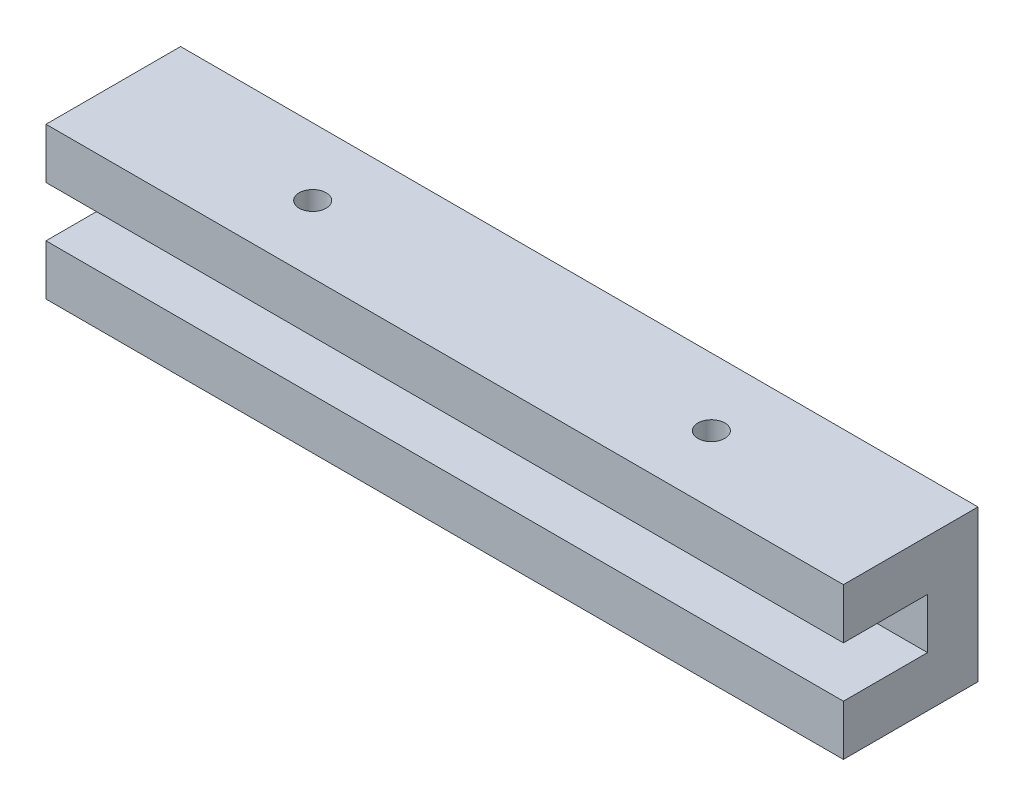
ISO-10303-21;
HEADER;
FILE_DESCRIPTION(('STEP AP214'),'2;1');
FILE_NAME('part.step','',(''),(''),'','','');
FILE_SCHEMA(('AUTOMOTIVE_DESIGN { 1 0 10303 214 1 1 1 1 }'));
ENDSEC;
DATA;
#1=APPLICATION_CONTEXT('core data for automotive mechanical design processes');
#2=APPLICATION_PROTOCOL_DEFINITION('international standard','automotive_design',2000,#1);
#3=PRODUCT_CONTEXT('',#1,'mechanical');
#4=PRODUCT('Part','Part','',(#3));
#5=PRODUCT_RELATED_PRODUCT_CATEGORY('part','',(#4));
#6=PRODUCT_DEFINITION_FORMATION('','',#4);
#7=PRODUCT_DEFINITION_CONTEXT('part definition',#1,'design');
#8=PRODUCT_DEFINITION('design','',#6,#7);
#9=PRODUCT_DEFINITION_SHAPE('','',#8);
#10=(LENGTH_UNIT() NAMED_UNIT(*) SI_UNIT(.MILLI.,.METRE.));
#11=(NAMED_UNIT(*) PLANE_ANGLE_UNIT() SI_UNIT($,.RADIAN.));
#12=(NAMED_UNIT(*) SI_UNIT($,.STERADIAN.) SOLID_ANGLE_UNIT());
#13=UNCERTAINTY_MEASURE_WITH_UNIT(LENGTH_MEASURE(1.E-05),#10,'distance_accuracy_value','');
#14=(GEOMETRIC_REPRESENTATION_CONTEXT(3) GLOBAL_UNCERTAINTY_ASSIGNED_CONTEXT((#13)) GLOBAL_UNIT_ASSIGNED_CONTEXT((#10,
#11,#12)) REPRESENTATION_CONTEXT('',''));
#15=CARTESIAN_POINT('',(0.,0.,0.));
#16=DIRECTION('',(0.,0.,1.));
#17=DIRECTION('',(1.,0.,0.));
#18=AXIS2_PLACEMENT_3D('',#15,#16,#17);
#19=CARTESIAN_POINT('',(-14.630866807611,9.,-13.4784355179704));
#20=DIRECTION('',(1.,0.,0.));
#21=DIRECTION('',(0.,0.,-1.));
#22=AXIS2_PLACEMENT_3D('',#19,#20,#21);
#23=PLANE('',#22);
#24=DIRECTION('',(0.,0.,-1.));
#25=VECTOR('',#24,1.);
#26=CARTESIAN_POINT('',(-14.630866807611,6.,-13.4784355179704));
#27=LINE('',#26,#25);
#28=CARTESIAN_POINT('',(-14.630866807611,6.,-5.47843551797036));
#29=VERTEX_POINT('',#28);
#30=CARTESIAN_POINT('',(-14.630866807611,6.,-10.4784355179704));
#31=VERTEX_POINT('',#30);
#32=EDGE_CURVE('E127',#29,#31,#27,.T.);
#33=ORIENTED_EDGE('',*,*,#32,.F.);
#34=DIRECTION('',(0.,-1.,0.));
#35=VECTOR('',#34,1.);
#36=CARTESIAN_POINT('',(-14.630866807611,9.,-5.4784355179704));
#37=LINE('',#36,#35);
#38=CARTESIAN_POINT('',(-14.630866807611,9.,-5.4784355179704));
#39=VERTEX_POINT('',#38);
#40=EDGE_CURVE('E143',#39,#29,#37,.T.);
#41=ORIENTED_EDGE('',*,*,#40,.F.);
#42=DIRECTION('',(0.,0.,1.));
#43=VECTOR('',#42,1.);
#44=CARTESIAN_POINT('',(-14.630866807611,9.,-13.4784355179704));
#45=LINE('',#44,#43);
#46=CARTESIAN_POINT('',(-14.630866807611,9.,-13.4784355179704));
#47=VERTEX_POINT('',#46);
#48=EDGE_CURVE('E177',#47,#39,#45,.T.);
#49=ORIENTED_EDGE('',*,*,#48,.F.);
#50=DIRECTION('',(0.,-1.,0.));
#51=VECTOR('',#50,1.);
#52=CARTESIAN_POINT('',(-14.630866807611,9.,-13.4784355179704));
#53=LINE('',#52,#51);
#54=CARTESIAN_POINT('',(-14.630866807611,0.,-13.4784355179704));
#55=VERTEX_POINT('',#54);
#56=EDGE_CURVE('E183',#47,#55,#53,.T.);
#57=ORIENTED_EDGE('',*,*,#56,.T.);
#58=DIRECTION('',(0.,0.,1.));
#59=VECTOR('',#58,1.);
#60=CARTESIAN_POINT('',(-14.630866807611,0.,-13.4784355179704));
#61=LINE('',#60,#59);
#62=CARTESIAN_POINT('',(-14.630866807611,0.,-5.4784355179704));
#63=VERTEX_POINT('',#62);
#64=EDGE_CURVE('E142',#55,#63,#61,.T.);
#65=ORIENTED_EDGE('',*,*,#64,.T.);
#66=CARTESIAN_POINT('',(-14.630866807611,3.,-5.47843551797036));
#67=VERTEX_POINT('',#66);
#68=EDGE_CURVE('E134',#67,#63,#37,.T.);
#69=ORIENTED_EDGE('',*,*,#68,.F.);
#70=DIRECTION('',(0.,0.,1.));
#71=VECTOR('',#70,1.);
#72=CARTESIAN_POINT('',(-14.630866807611,3.,-13.4784355179704));
#73=LINE('',#72,#71);
#74=CARTESIAN_POINT('',(-14.630866807611,3.,-10.4784355179704));
#75=VERTEX_POINT('',#74);
#76=EDGE_CURVE('E120',#75,#67,#73,.T.);
#77=ORIENTED_EDGE('',*,*,#76,.F.);
#78=DIRECTION('',(0.,-1.,0.));
#79=VECTOR('',#78,1.);
#80=CARTESIAN_POINT('',(-14.630866807611,9.,-10.4784355179704));
#81=LINE('',#80,#79);
#82=EDGE_CURVE('E175',#31,#75,#81,.T.);
#83=ORIENTED_EDGE('',*,*,#82,.F.);
#84=EDGE_LOOP('',(#33,#41,#49,#57,#65,#69,#77,#83));
#85=FACE_BOUND('',#84,.T.);
#86=ADVANCED_FACE('F46',(#85),#23,.F.);
#87=CARTESIAN_POINT('',(-14.630866807611,9.,-5.4784355179704));
#88=DIRECTION('',(0.,0.,-1.));
#89=DIRECTION('',(-1.,0.,0.));
#90=AXIS2_PLACEMENT_3D('',#87,#88,#89);
#91=PLANE('',#90);
#92=DIRECTION('',(-1.,0.,0.));
#93=VECTOR('',#92,1.);
#94=CARTESIAN_POINT('',(49.769133192389,6.,-5.47843551797042));
#95=LINE('',#94,#93);
#96=CARTESIAN_POINT('',(32.769133192389,6.,-5.4784355179704));
#97=VERTEX_POINT('',#96);
#98=EDGE_CURVE('E137',#97,#29,#95,.T.);
#99=ORIENTED_EDGE('',*,*,#98,.F.);
#100=DIRECTION('',(0.,-1.,0.));
#101=VECTOR('',#100,1.);
#102=CARTESIAN_POINT('',(32.769133192389,9.,-5.4784355179704));
#103=LINE('',#102,#101);
#104=CARTESIAN_POINT('',(32.769133192389,9.,-5.4784355179704));
#105=VERTEX_POINT('',#104);
#106=EDGE_CURVE('E144',#105,#97,#103,.T.);
#107=ORIENTED_EDGE('',*,*,#106,.F.);
#108=DIRECTION('',(1.,0.,0.));
#109=VECTOR('',#108,1.);
#110=CARTESIAN_POINT('',(-14.630866807611,9.,-5.4784355179704));
#111=LINE('',#110,#109);
#112=EDGE_CURVE('E100',#39,#105,#111,.T.);
#113=ORIENTED_EDGE('',*,*,#112,.F.);
#114=ORIENTED_EDGE('',*,*,#40,.T.);
#115=EDGE_LOOP('',(#99,#107,#113,#114));
#116=FACE_BOUND('',#115,.T.);
#117=ADVANCED_FACE('F217',(#116),#91,.F.);
#118=DIRECTION('',(-1.,0.,0.));
#119=VECTOR('',#118,1.);
#120=CARTESIAN_POINT('',(49.769133192389,3.,-5.47843551797042));
#121=LINE('',#120,#119);
#122=CARTESIAN_POINT('',(32.769133192389,3.,-5.4784355179704));
#123=VERTEX_POINT('',#122);
#124=EDGE_CURVE('E62',#123,#67,#121,.T.);
#125=ORIENTED_EDGE('',*,*,#124,.T.);
#126=ORIENTED_EDGE('',*,*,#68,.T.);
#127=DIRECTION('',(1.,0.,0.));
#128=VECTOR('',#127,1.);
#129=CARTESIAN_POINT('',(-14.630866807611,0.,-5.4784355179704));
#130=LINE('',#129,#128);
#131=CARTESIAN_POINT('',(32.769133192389,0.,-5.4784355179704));
#132=VERTEX_POINT('',#131);
#133=EDGE_CURVE('E185',#63,#132,#130,.T.);
#134=ORIENTED_EDGE('',*,*,#133,.T.);
#135=EDGE_CURVE('E136',#123,#132,#103,.T.);
#136=ORIENTED_EDGE('',*,*,#135,.F.);
#137=EDGE_LOOP('',(#125,#126,#134,#136));
#138=FACE_BOUND('',#137,.T.);
#139=ADVANCED_FACE('F132',(#138),#91,.F.);
#140=CARTESIAN_POINT('',(32.769133192389,9.,-13.4784355179704));
#141=DIRECTION('',(-1.,0.,0.));
#142=DIRECTION('',(0.,0.,1.));
#143=AXIS2_PLACEMENT_3D('',#140,#141,#142);
#144=PLANE('',#143);
#145=DIRECTION('',(0.,0.,1.));
#146=VECTOR('',#145,1.);
#147=CARTESIAN_POINT('',(32.769133192389,6.,-13.4784355179704));
#148=LINE('',#147,#146);
#149=CARTESIAN_POINT('',(32.769133192389,6.,-10.4784355179704));
#150=VERTEX_POINT('',#149);
#151=EDGE_CURVE('E11',#150,#97,#148,.T.);
#152=ORIENTED_EDGE('',*,*,#151,.F.);
#153=DIRECTION('',(0.,1.,0.));
#154=VECTOR('',#153,1.);
#155=CARTESIAN_POINT('',(32.769133192389,9.,-10.4784355179704));
#156=LINE('',#155,#154);
#157=CARTESIAN_POINT('',(32.769133192389,3.,-10.4784355179704));
#158=VERTEX_POINT('',#157);
#159=EDGE_CURVE('E54',#158,#150,#156,.T.);
#160=ORIENTED_EDGE('',*,*,#159,.F.);
#161=DIRECTION('',(0.,0.,-1.));
#162=VECTOR('',#161,1.);
#163=CARTESIAN_POINT('',(32.769133192389,3.,-13.4784355179704));
#164=LINE('',#163,#162);
#165=EDGE_CURVE('E146',#123,#158,#164,.T.);
#166=ORIENTED_EDGE('',*,*,#165,.F.);
#167=ORIENTED_EDGE('',*,*,#135,.T.);
#168=DIRECTION('',(0.,0.,-1.));
#169=VECTOR('',#168,1.);
#170=CARTESIAN_POINT('',(32.769133192389,0.,-13.4784355179704));
#171=LINE('',#170,#169);
#172=CARTESIAN_POINT('',(32.769133192389,0.,-13.4784355179704));
#173=VERTEX_POINT('',#172);
#174=EDGE_CURVE('E187',#132,#173,#171,.T.);
#175=ORIENTED_EDGE('',*,*,#174,.T.);
#176=DIRECTION('',(0.,-1.,0.));
#177=VECTOR('',#176,1.);
#178=CARTESIAN_POINT('',(32.769133192389,9.,-13.4784355179704));
#179=LINE('',#178,#177);
#180=CARTESIAN_POINT('',(32.769133192389,9.,-13.4784355179704));
#181=VERTEX_POINT('',#180);
#182=EDGE_CURVE('E190',#181,#173,#179,.T.);
#183=ORIENTED_EDGE('',*,*,#182,.F.);
#184=DIRECTION('',(0.,0.,-1.));
#185=VECTOR('',#184,1.);
#186=CARTESIAN_POINT('',(32.769133192389,9.,-13.4784355179704));
#187=LINE('',#186,#185);
#188=EDGE_CURVE('E180',#105,#181,#187,.T.);
#189=ORIENTED_EDGE('',*,*,#188,.F.);
#190=ORIENTED_EDGE('',*,*,#106,.T.);
#191=EDGE_LOOP('',(#152,#160,#166,#167,#175,#183,#189,#190));
#192=FACE_BOUND('',#191,.T.);
#193=ADVANCED_FACE('F194',(#192),#144,.F.);
#194=CARTESIAN_POINT('',(-14.630866807611,9.,-13.4784355179704));
#195=DIRECTION('',(0.,0.,1.));
#196=DIRECTION('',(1.,0.,0.));
#197=AXIS2_PLACEMENT_3D('',#194,#195,#196);
#198=PLANE('',#197);
#199=DIRECTION('',(-1.,0.,0.));
#200=VECTOR('',#199,1.);
#201=CARTESIAN_POINT('',(-14.630866807611,0.,-13.4784355179704));
#202=LINE('',#201,#200);
#203=EDGE_CURVE('E92',#173,#55,#202,.T.);
#204=ORIENTED_EDGE('',*,*,#203,.T.);
#205=ORIENTED_EDGE('',*,*,#56,.F.);
#206=DIRECTION('',(-1.,0.,0.));
#207=VECTOR('',#206,1.);
#208=CARTESIAN_POINT('',(-14.630866807611,9.,-13.4784355179704));
#209=LINE('',#208,#207);
#210=EDGE_CURVE('E71',#181,#47,#209,.T.);
#211=ORIENTED_EDGE('',*,*,#210,.F.);
#212=ORIENTED_EDGE('',*,*,#182,.T.);
#213=EDGE_LOOP('',(#204,#205,#211,#212));
#214=FACE_BOUND('',#213,.T.);
#215=ADVANCED_FACE('F211',(#214),#198,.F.);
#216=CARTESIAN_POINT('',(0.,9.,0.));
#217=DIRECTION('',(0.,1.,0.));
#218=DIRECTION('',(0.,0.,1.));
#219=AXIS2_PLACEMENT_3D('',#216,#217,#218);
#220=PLANE('',#219);
#221=CARTESIAN_POINT('',(-2.78086680761099,9.,-9.4784355179704));
#222=DIRECTION('',(0.,1.,0.));
#223=DIRECTION('',(0.,0.,1.));
#224=AXIS2_PLACEMENT_3D('',#221,#222,#223);
#225=CIRCLE('',#224,0.799999999999988);
#226=CARTESIAN_POINT('',(-2.78086680761099,9.,-8.67843551797042));
#227=VERTEX_POINT('',#226);
#228=EDGE_CURVE('E380',#227,#227,#225,.T.);
#229=ORIENTED_EDGE('',*,*,#228,.F.);
#230=EDGE_LOOP('',(#229));
#231=FACE_BOUND('',#230,.T.);
#232=CARTESIAN_POINT('',(20.919133192389,9.,-9.4784355179704));
#233=DIRECTION('',(0.,1.,0.));
#234=DIRECTION('',(0.,0.,1.));
#235=AXIS2_PLACEMENT_3D('',#232,#233,#234);
#236=CIRCLE('',#235,0.799999999999988);
#237=CARTESIAN_POINT('',(20.919133192389,9.,-8.67843551797042));
#238=VERTEX_POINT('',#237);
#239=EDGE_CURVE('E161',#238,#238,#236,.T.);
#240=ORIENTED_EDGE('',*,*,#239,.F.);
#241=EDGE_LOOP('',(#240));
#242=FACE_BOUND('',#241,.T.);
#243=ORIENTED_EDGE('',*,*,#48,.T.);
#244=ORIENTED_EDGE('',*,*,#112,.T.);
#245=ORIENTED_EDGE('',*,*,#188,.T.);
#246=ORIENTED_EDGE('',*,*,#210,.T.);
#247=EDGE_LOOP('',(#243,#244,#245,#246));
#248=FACE_BOUND('',#247,.T.);
#249=ADVANCED_FACE('F201',(#231,#242,#248),#220,.T.);
#250=CARTESIAN_POINT('',(0.,0.,0.));
#251=DIRECTION('',(0.,1.,0.));
#252=DIRECTION('',(0.,0.,1.));
#253=AXIS2_PLACEMENT_3D('',#250,#251,#252);
#254=PLANE('',#253);
#255=CARTESIAN_POINT('',(-2.78086680761099,0.,-9.4784355179704));
#256=DIRECTION('',(0.,1.,0.));
#257=DIRECTION('',(0.,0.,1.));
#258=AXIS2_PLACEMENT_3D('',#255,#256,#257);
#259=CIRCLE('',#258,0.799999999999998);
#260=CARTESIAN_POINT('',(-2.78086680761099,0.,-8.6784355179704));
#261=VERTEX_POINT('',#260);
#262=EDGE_CURVE('E377',#261,#261,#259,.T.);
#263=ORIENTED_EDGE('',*,*,#262,.T.);
#264=EDGE_LOOP('',(#263));
#265=FACE_BOUND('',#264,.T.);
#266=CARTESIAN_POINT('',(20.919133192389,0.,-9.4784355179704));
#267=DIRECTION('',(0.,1.,0.));
#268=DIRECTION('',(0.,0.,1.));
#269=AXIS2_PLACEMENT_3D('',#266,#267,#268);
#270=CIRCLE('',#269,0.799999999999999);
#271=CARTESIAN_POINT('',(20.919133192389,0.,-8.6784355179704));
#272=VERTEX_POINT('',#271);
#273=EDGE_CURVE('E155',#272,#272,#270,.T.);
#274=ORIENTED_EDGE('',*,*,#273,.T.);
#275=EDGE_LOOP('',(#274));
#276=FACE_BOUND('',#275,.T.);
#277=ORIENTED_EDGE('',*,*,#64,.F.);
#278=ORIENTED_EDGE('',*,*,#203,.F.);
#279=ORIENTED_EDGE('',*,*,#174,.F.);
#280=ORIENTED_EDGE('',*,*,#133,.F.);
#281=EDGE_LOOP('',(#277,#278,#279,#280));
#282=FACE_BOUND('',#281,.T.);
#283=ADVANCED_FACE('F198',(#265,#276,#282),#254,.F.);
#284=CARTESIAN_POINT('',(49.769133192389,3.,-10.4784355179704));
#285=DIRECTION('',(0.,0.,1.));
#286=DIRECTION('',(1.,0.,0.));
#287=AXIS2_PLACEMENT_3D('',#284,#285,#286);
#288=PLANE('',#287);
#289=ORIENTED_EDGE('',*,*,#82,.T.);
#290=DIRECTION('',(-1.,0.,0.));
#291=VECTOR('',#290,1.);
#292=CARTESIAN_POINT('',(49.769133192389,3.,-10.4784355179704));
#293=LINE('',#292,#291);
#294=EDGE_CURVE('E123',#158,#75,#293,.T.);
#295=ORIENTED_EDGE('',*,*,#294,.F.);
#296=ORIENTED_EDGE('',*,*,#159,.T.);
#297=DIRECTION('',(-1.,0.,0.));
#298=VECTOR('',#297,1.);
#299=CARTESIAN_POINT('',(49.769133192389,6.,-10.4784355179704));
#300=LINE('',#299,#298);
#301=EDGE_CURVE('E128',#150,#31,#300,.T.);
#302=ORIENTED_EDGE('',*,*,#301,.T.);
#303=EDGE_LOOP('',(#289,#295,#296,#302));
#304=FACE_BOUND('',#303,.T.);
#305=ADVANCED_FACE('F200',(#304),#288,.T.);
#306=CARTESIAN_POINT('',(49.769133192389,6.,-5.47843551797042));
#307=DIRECTION('',(0.,-1.,0.));
#308=DIRECTION('',(0.,0.,-1.));
#309=AXIS2_PLACEMENT_3D('',#306,#307,#308);
#310=PLANE('',#309);
#311=CARTESIAN_POINT('',(-2.78086680761099,6.,-9.4784355179704));
#312=DIRECTION('',(0.,-1.,0.));
#313=DIRECTION('',(0.,0.,-1.));
#314=AXIS2_PLACEMENT_3D('',#311,#312,#313);
#315=CIRCLE('',#314,0.799999999999993);
#316=CARTESIAN_POINT('',(-2.78086680761099,6.,-10.2784355179704));
#317=VERTEX_POINT('',#316);
#318=EDGE_CURVE('E166',#317,#317,#315,.T.);
#319=ORIENTED_EDGE('',*,*,#318,.F.);
#320=EDGE_LOOP('',(#319));
#321=FACE_BOUND('',#320,.T.);
#322=CARTESIAN_POINT('',(20.919133192389,6.,-9.4784355179704));
#323=DIRECTION('',(0.,-1.,0.));
#324=DIRECTION('',(0.,0.,-1.));
#325=AXIS2_PLACEMENT_3D('',#322,#323,#324);
#326=CIRCLE('',#325,0.799999999999993);
#327=CARTESIAN_POINT('',(20.919133192389,6.,-10.2784355179704));
#328=VERTEX_POINT('',#327);
#329=EDGE_CURVE('E152',#328,#328,#326,.T.);
#330=ORIENTED_EDGE('',*,*,#329,.F.);
#331=EDGE_LOOP('',(#330));
#332=FACE_BOUND('',#331,.T.);
#333=ORIENTED_EDGE('',*,*,#32,.T.);
#334=ORIENTED_EDGE('',*,*,#301,.F.);
#335=ORIENTED_EDGE('',*,*,#151,.T.);
#336=ORIENTED_EDGE('',*,*,#98,.T.);
#337=EDGE_LOOP('',(#333,#334,#335,#336));
#338=FACE_BOUND('',#337,.T.);
#339=ADVANCED_FACE('F208',(#321,#332,#338),#310,.T.);
#340=CARTESIAN_POINT('',(49.769133192389,3.,-5.47843551797042));
#341=DIRECTION('',(0.,1.,0.));
#342=DIRECTION('',(0.,0.,1.));
#343=AXIS2_PLACEMENT_3D('',#340,#341,#342);
#344=PLANE('',#343);
#345=CARTESIAN_POINT('',(-2.78086680761099,3.,-9.4784355179704));
#346=DIRECTION('',(0.,1.,0.));
#347=DIRECTION('',(0.,0.,1.));
#348=AXIS2_PLACEMENT_3D('',#345,#346,#347);
#349=CIRCLE('',#348,0.799999999999993);
#350=CARTESIAN_POINT('',(-2.78086680761099,3.,-8.67843551797041));
#351=VERTEX_POINT('',#350);
#352=EDGE_CURVE('E49',#351,#351,#349,.T.);
#353=ORIENTED_EDGE('',*,*,#352,.F.);
#354=EDGE_LOOP('',(#353));
#355=FACE_BOUND('',#354,.T.);
#356=CARTESIAN_POINT('',(20.919133192389,3.,-9.4784355179704));
#357=DIRECTION('',(0.,1.,0.));
#358=DIRECTION('',(0.,0.,1.));
#359=AXIS2_PLACEMENT_3D('',#356,#357,#358);
#360=CIRCLE('',#359,0.799999999999993);
#361=CARTESIAN_POINT('',(20.919133192389,3.,-8.67843551797041));
#362=VERTEX_POINT('',#361);
#363=EDGE_CURVE('E154',#362,#362,#360,.T.);
#364=ORIENTED_EDGE('',*,*,#363,.F.);
#365=EDGE_LOOP('',(#364));
#366=FACE_BOUND('',#365,.T.);
#367=ORIENTED_EDGE('',*,*,#76,.T.);
#368=ORIENTED_EDGE('',*,*,#124,.F.);
#369=ORIENTED_EDGE('',*,*,#165,.T.);
#370=ORIENTED_EDGE('',*,*,#294,.T.);
#371=EDGE_LOOP('',(#367,#368,#369,#370));
#372=FACE_BOUND('',#371,.T.);
#373=ADVANCED_FACE('F121',(#355,#366,#372),#344,.T.);
#374=CARTESIAN_POINT('',(20.919133192389,9.,-9.4784355179704));
#375=DIRECTION('',(0.,1.,0.));
#376=DIRECTION('',(0.,0.,1.));
#377=AXIS2_PLACEMENT_3D('',#374,#375,#376);
#378=CYLINDRICAL_SURFACE('',#377,0.799999999999993);
#379=ORIENTED_EDGE('',*,*,#329,.T.);
#380=EDGE_LOOP('',(#379));
#381=FACE_BOUND('',#380,.T.);
#382=ORIENTED_EDGE('',*,*,#239,.T.);
#383=EDGE_LOOP('',(#382));
#384=FACE_BOUND('',#383,.T.);
#385=ADVANCED_FACE('F247',(#381,#384),#378,.F.);
#386=ORIENTED_EDGE('',*,*,#363,.T.);
#387=EDGE_LOOP('',(#386));
#388=FACE_BOUND('',#387,.T.);
#389=ORIENTED_EDGE('',*,*,#273,.F.);
#390=EDGE_LOOP('',(#389));
#391=FACE_BOUND('',#390,.T.);
#392=ADVANCED_FACE('F251',(#388,#391),#378,.F.);
#393=CARTESIAN_POINT('',(-2.78086680761099,9.,-9.4784355179704));
#394=DIRECTION('',(0.,1.,0.));
#395=DIRECTION('',(0.,0.,1.));
#396=AXIS2_PLACEMENT_3D('',#393,#394,#395);
#397=CYLINDRICAL_SURFACE('',#396,0.799999999999993);
#398=ORIENTED_EDGE('',*,*,#352,.T.);
#399=EDGE_LOOP('',(#398));
#400=FACE_BOUND('',#399,.T.);
#401=ORIENTED_EDGE('',*,*,#262,.F.);
#402=EDGE_LOOP('',(#401));
#403=FACE_BOUND('',#402,.T.);
#404=ADVANCED_FACE('F257',(#400,#403),#397,.F.);
#405=ORIENTED_EDGE('',*,*,#318,.T.);
#406=EDGE_LOOP('',(#405));
#407=FACE_BOUND('',#406,.T.);
#408=ORIENTED_EDGE('',*,*,#228,.T.);
#409=EDGE_LOOP('',(#408));
#410=FACE_BOUND('',#409,.T.);
#411=ADVANCED_FACE('F243',(#407,#410),#397,.F.);
#412=CLOSED_SHELL('',(#86,#117,#139,#193,#215,#249,#283,#305,#339,#373,#385,#392,#404,#411));
#413=MANIFOLD_SOLID_BREP('B2',#412);
#414=ADVANCED_BREP_SHAPE_REPRESENTATION('',(#18,#413),#14);
#415=SHAPE_DEFINITION_REPRESENTATION(#9,#414);
ENDSEC;
END-ISO-10303-21;
